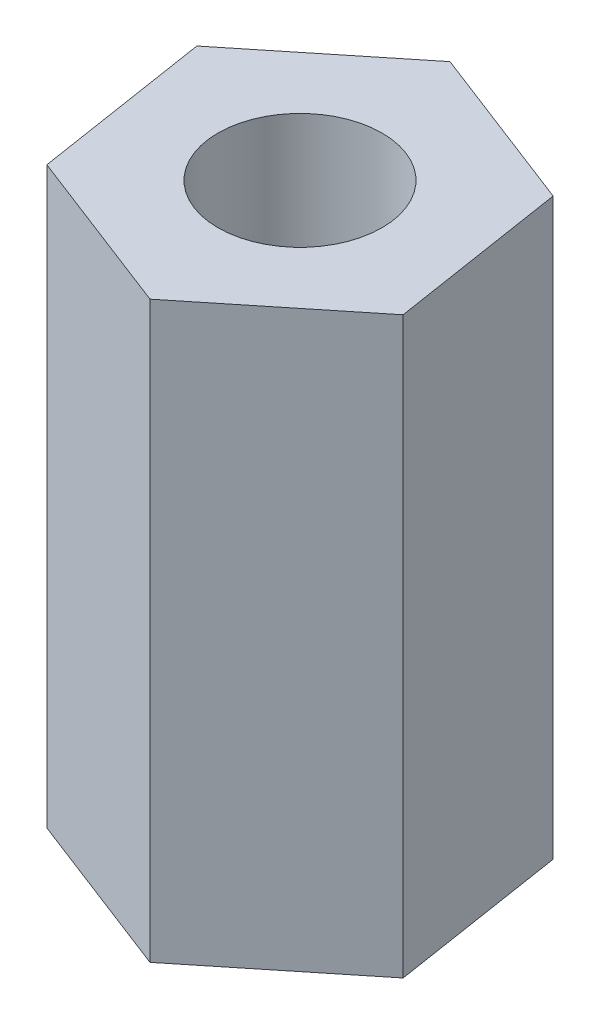
ISO-10303-21;
HEADER;
FILE_DESCRIPTION(('STEP AP214'),'2;1');
FILE_NAME('part.step','',(''),(''),'','','');
FILE_SCHEMA(('AUTOMOTIVE_DESIGN { 1 0 10303 214 1 1 1 1 }'));
ENDSEC;
DATA;
#1=APPLICATION_CONTEXT('core data for automotive mechanical design processes');
#2=APPLICATION_PROTOCOL_DEFINITION('international standard','automotive_design',2000,#1);
#3=PRODUCT_CONTEXT('',#1,'mechanical');
#4=PRODUCT('Part','Part','',(#3));
#5=PRODUCT_RELATED_PRODUCT_CATEGORY('part','',(#4));
#6=PRODUCT_DEFINITION_FORMATION('','',#4);
#7=PRODUCT_DEFINITION_CONTEXT('part definition',#1,'design');
#8=PRODUCT_DEFINITION('design','',#6,#7);
#9=PRODUCT_DEFINITION_SHAPE('','',#8);
#10=(LENGTH_UNIT() NAMED_UNIT(*) SI_UNIT(.MILLI.,.METRE.));
#11=(NAMED_UNIT(*) PLANE_ANGLE_UNIT() SI_UNIT($,.RADIAN.));
#12=(NAMED_UNIT(*) SI_UNIT($,.STERADIAN.) SOLID_ANGLE_UNIT());
#13=UNCERTAINTY_MEASURE_WITH_UNIT(LENGTH_MEASURE(1.E-05),#10,'distance_accuracy_value','');
#14=(GEOMETRIC_REPRESENTATION_CONTEXT(3) GLOBAL_UNCERTAINTY_ASSIGNED_CONTEXT((#13)) GLOBAL_UNIT_ASSIGNED_CONTEXT((#10,
#11,#12)) REPRESENTATION_CONTEXT('',''));
#15=CARTESIAN_POINT('',(0.,0.,0.));
#16=DIRECTION('',(0.,0.,1.));
#17=DIRECTION('',(1.,0.,0.));
#18=AXIS2_PLACEMENT_3D('',#15,#16,#17);
#19=CARTESIAN_POINT('',(0.,35.,0.));
#20=DIRECTION('',(0.,1.,0.));
#21=DIRECTION('',(0.,0.,1.));
#22=AXIS2_PLACEMENT_3D('',#19,#20,#21);
#23=PLANE('',#22);
#24=DIRECTION('',(-0.778296176752676,0.,0.627897333369211));
#25=VECTOR('',#24,1.);
#26=CARTESIAN_POINT('',(-1.69620434901207,35.,-10.83772227637));
#27=LINE('',#26,#25);
#28=CARTESIAN_POINT('',(-1.69620434901207,35.,-10.83772227637));
#29=VERTEX_POINT('',#28);
#30=CARTESIAN_POINT('',(-10.2338449850029,35.,-3.94990508193089));
#31=VERTEX_POINT('',#30);
#32=EDGE_CURVE('E150',#29,#31,#27,.T.);
#33=ORIENTED_EDGE('',*,*,#32,.T.);
#34=DIRECTION('',(0.154626953289905,0.,0.987972927420727));
#35=VECTOR('',#34,1.);
#36=CARTESIAN_POINT('',(-10.2338449850029,35.,-3.94990508193089));
#37=LINE('',#36,#35);
#38=CARTESIAN_POINT('',(-8.53764063599088,35.,6.88781719443908));
#39=VERTEX_POINT('',#38);
#40=EDGE_CURVE('E98',#31,#39,#37,.T.);
#41=ORIENTED_EDGE('',*,*,#40,.T.);
#42=DIRECTION('',(0.932923130042582,0.,0.360075594051516));
#43=VECTOR('',#42,1.);
#44=CARTESIAN_POINT('',(-8.53764063599088,35.,6.88781719443908));
#45=LINE('',#44,#43);
#46=CARTESIAN_POINT('',(1.69620434901207,35.,10.83772227637));
#47=VERTEX_POINT('',#46);
#48=EDGE_CURVE('E111',#39,#47,#45,.T.);
#49=ORIENTED_EDGE('',*,*,#48,.T.);
#50=DIRECTION('',(0.778296176752677,0.,-0.627897333369211));
#51=VECTOR('',#50,1.);
#52=CARTESIAN_POINT('',(1.69620434901207,35.,10.83772227637));
#53=LINE('',#52,#51);
#54=CARTESIAN_POINT('',(10.2338449850029,35.,3.94990508193089));
#55=VERTEX_POINT('',#54);
#56=EDGE_CURVE('E105',#47,#55,#53,.T.);
#57=ORIENTED_EDGE('',*,*,#56,.T.);
#58=DIRECTION('',(-0.154626953289905,0.,-0.987972927420727));
#59=VECTOR('',#58,1.);
#60=CARTESIAN_POINT('',(10.2338449850029,35.,3.94990508193089));
#61=LINE('',#60,#59);
#62=CARTESIAN_POINT('',(8.53764063599088,35.,-6.88781719443908));
#63=VERTEX_POINT('',#62);
#64=EDGE_CURVE('E109',#55,#63,#61,.T.);
#65=ORIENTED_EDGE('',*,*,#64,.T.);
#66=DIRECTION('',(-0.932923130042582,0.,-0.360075594051516));
#67=VECTOR('',#66,1.);
#68=CARTESIAN_POINT('',(8.53764063599088,35.,-6.88781719443908));
#69=LINE('',#68,#67);
#70=EDGE_CURVE('E61',#63,#29,#69,.T.);
#71=ORIENTED_EDGE('',*,*,#70,.T.);
#72=EDGE_LOOP('',(#33,#41,#49,#57,#65,#71));
#73=FACE_BOUND('',#72,.T.);
#74=CARTESIAN_POINT('',(0.,35.,0.));
#75=DIRECTION('',(0.,1.,0.));
#76=DIRECTION('',(0.,0.,1.));
#77=AXIS2_PLACEMENT_3D('',#74,#75,#76);
#78=CIRCLE('',#77,5.);
#79=CARTESIAN_POINT('',(0.,35.,5.));
#80=VERTEX_POINT('',#79);
#81=EDGE_CURVE('E138',#80,#80,#78,.T.);
#82=ORIENTED_EDGE('',*,*,#81,.F.);
#83=EDGE_LOOP('',(#82));
#84=FACE_BOUND('',#83,.T.);
#85=ADVANCED_FACE('F43',(#73,#84),#23,.T.);
#86=CARTESIAN_POINT('',(0.,0.,0.));
#87=DIRECTION('',(0.,1.,0.));
#88=DIRECTION('',(0.,0.,1.));
#89=AXIS2_PLACEMENT_3D('',#86,#87,#88);
#90=PLANE('',#89);
#91=DIRECTION('',(-0.778296176752676,0.,0.627897333369211));
#92=VECTOR('',#91,1.);
#93=CARTESIAN_POINT('',(-1.69620434901207,0.,-10.83772227637));
#94=LINE('',#93,#92);
#95=CARTESIAN_POINT('',(-1.69620434901207,0.,-10.83772227637));
#96=VERTEX_POINT('',#95);
#97=CARTESIAN_POINT('',(-10.2338449850029,0.,-3.94990508193089));
#98=VERTEX_POINT('',#97);
#99=EDGE_CURVE('E133',#96,#98,#94,.T.);
#100=ORIENTED_EDGE('',*,*,#99,.F.);
#101=DIRECTION('',(-0.932923130042582,0.,-0.360075594051516));
#102=VECTOR('',#101,1.);
#103=CARTESIAN_POINT('',(8.53764063599088,0.,-6.88781719443908));
#104=LINE('',#103,#102);
#105=CARTESIAN_POINT('',(8.53764063599088,0.,-6.88781719443908));
#106=VERTEX_POINT('',#105);
#107=EDGE_CURVE('E90',#106,#96,#104,.T.);
#108=ORIENTED_EDGE('',*,*,#107,.F.);
#109=DIRECTION('',(-0.154626953289905,0.,-0.987972927420727));
#110=VECTOR('',#109,1.);
#111=CARTESIAN_POINT('',(10.2338449850029,0.,3.94990508193089));
#112=LINE('',#111,#110);
#113=CARTESIAN_POINT('',(10.2338449850029,0.,3.94990508193089));
#114=VERTEX_POINT('',#113);
#115=EDGE_CURVE('E84',#114,#106,#112,.T.);
#116=ORIENTED_EDGE('',*,*,#115,.F.);
#117=DIRECTION('',(0.778296176752677,0.,-0.627897333369211));
#118=VECTOR('',#117,1.);
#119=CARTESIAN_POINT('',(1.69620434901207,0.,10.83772227637));
#120=LINE('',#119,#118);
#121=CARTESIAN_POINT('',(1.69620434901207,0.,10.83772227637));
#122=VERTEX_POINT('',#121);
#123=EDGE_CURVE('E120',#122,#114,#120,.T.);
#124=ORIENTED_EDGE('',*,*,#123,.F.);
#125=DIRECTION('',(0.932923130042582,0.,0.360075594051516));
#126=VECTOR('',#125,1.);
#127=CARTESIAN_POINT('',(-8.53764063599088,0.,6.88781719443908));
#128=LINE('',#127,#126);
#129=CARTESIAN_POINT('',(-8.53764063599088,0.,6.88781719443908));
#130=VERTEX_POINT('',#129);
#131=EDGE_CURVE('E141',#130,#122,#128,.T.);
#132=ORIENTED_EDGE('',*,*,#131,.F.);
#133=DIRECTION('',(0.154626953289905,0.,0.987972927420727));
#134=VECTOR('',#133,1.);
#135=CARTESIAN_POINT('',(-10.2338449850029,0.,-3.94990508193089));
#136=LINE('',#135,#134);
#137=EDGE_CURVE('E137',#98,#130,#136,.T.);
#138=ORIENTED_EDGE('',*,*,#137,.F.);
#139=EDGE_LOOP('',(#100,#108,#116,#124,#132,#138));
#140=FACE_BOUND('',#139,.T.);
#141=CARTESIAN_POINT('',(0.,0.,0.));
#142=DIRECTION('',(0.,1.,0.));
#143=DIRECTION('',(0.,0.,1.));
#144=AXIS2_PLACEMENT_3D('',#141,#142,#143);
#145=CIRCLE('',#144,5.);
#146=CARTESIAN_POINT('',(0.,0.,5.));
#147=VERTEX_POINT('',#146);
#148=EDGE_CURVE('E265',#147,#147,#145,.T.);
#149=ORIENTED_EDGE('',*,*,#148,.T.);
#150=EDGE_LOOP('',(#149));
#151=FACE_BOUND('',#150,.T.);
#152=ADVANCED_FACE('F163',(#140,#151),#90,.F.);
#153=CARTESIAN_POINT('',(-1.69620434901207,35.,-10.83772227637));
#154=DIRECTION('',(0.627897333369211,0.,0.778296176752676));
#155=DIRECTION('',(0.778296176752676,0.,-0.627897333369211));
#156=AXIS2_PLACEMENT_3D('',#153,#154,#155);
#157=PLANE('',#156);
#158=ORIENTED_EDGE('',*,*,#99,.T.);
#159=DIRECTION('',(0.,-1.,0.));
#160=VECTOR('',#159,1.);
#161=CARTESIAN_POINT('',(-10.2338449850029,35.,-3.94990508193089));
#162=LINE('',#161,#160);
#163=EDGE_CURVE('E11',#31,#98,#162,.T.);
#164=ORIENTED_EDGE('',*,*,#163,.F.);
#165=ORIENTED_EDGE('',*,*,#32,.F.);
#166=DIRECTION('',(0.,-1.,0.));
#167=VECTOR('',#166,1.);
#168=CARTESIAN_POINT('',(-1.69620434901207,35.,-10.83772227637));
#169=LINE('',#168,#167);
#170=EDGE_CURVE('E129',#29,#96,#169,.T.);
#171=ORIENTED_EDGE('',*,*,#170,.T.);
#172=EDGE_LOOP('',(#158,#164,#165,#171));
#173=FACE_BOUND('',#172,.T.);
#174=ADVANCED_FACE('F45',(#173),#157,.F.);
#175=CARTESIAN_POINT('',(-10.2338449850029,35.,-3.94990508193089));
#176=DIRECTION('',(0.987972927420727,0.,-0.154626953289905));
#177=DIRECTION('',(-0.154626953289905,0.,-0.987972927420727));
#178=AXIS2_PLACEMENT_3D('',#175,#176,#177);
#179=PLANE('',#178);
#180=ORIENTED_EDGE('',*,*,#137,.T.);
#181=DIRECTION('',(0.,-1.,0.));
#182=VECTOR('',#181,1.);
#183=CARTESIAN_POINT('',(-8.53764063599088,35.,6.88781719443908));
#184=LINE('',#183,#182);
#185=EDGE_CURVE('E53',#39,#130,#184,.T.);
#186=ORIENTED_EDGE('',*,*,#185,.F.);
#187=ORIENTED_EDGE('',*,*,#40,.F.);
#188=ORIENTED_EDGE('',*,*,#163,.T.);
#189=EDGE_LOOP('',(#180,#186,#187,#188));
#190=FACE_BOUND('',#189,.T.);
#191=ADVANCED_FACE('F188',(#190),#179,.F.);
#192=CARTESIAN_POINT('',(-8.53764063599088,35.,6.88781719443908));
#193=DIRECTION('',(0.360075594051516,0.,-0.932923130042582));
#194=DIRECTION('',(-0.932923130042582,0.,-0.360075594051516));
#195=AXIS2_PLACEMENT_3D('',#192,#193,#194);
#196=PLANE('',#195);
#197=ORIENTED_EDGE('',*,*,#131,.T.);
#198=DIRECTION('',(0.,-1.,0.));
#199=VECTOR('',#198,1.);
#200=CARTESIAN_POINT('',(1.69620434901207,35.,10.83772227637));
#201=LINE('',#200,#199);
#202=EDGE_CURVE('E122',#47,#122,#201,.T.);
#203=ORIENTED_EDGE('',*,*,#202,.F.);
#204=ORIENTED_EDGE('',*,*,#48,.F.);
#205=ORIENTED_EDGE('',*,*,#185,.T.);
#206=EDGE_LOOP('',(#197,#203,#204,#205));
#207=FACE_BOUND('',#206,.T.);
#208=ADVANCED_FACE('F160',(#207),#196,.F.);
#209=CARTESIAN_POINT('',(1.69620434901207,35.,10.83772227637));
#210=DIRECTION('',(-0.627897333369211,0.,-0.778296176752677));
#211=DIRECTION('',(-0.778296176752677,0.,0.627897333369211));
#212=AXIS2_PLACEMENT_3D('',#209,#210,#211);
#213=PLANE('',#212);
#214=ORIENTED_EDGE('',*,*,#123,.T.);
#215=DIRECTION('',(0.,-1.,0.));
#216=VECTOR('',#215,1.);
#217=CARTESIAN_POINT('',(10.2338449850029,35.,3.94990508193089));
#218=LINE('',#217,#216);
#219=EDGE_CURVE('E117',#55,#114,#218,.T.);
#220=ORIENTED_EDGE('',*,*,#219,.F.);
#221=ORIENTED_EDGE('',*,*,#56,.F.);
#222=ORIENTED_EDGE('',*,*,#202,.T.);
#223=EDGE_LOOP('',(#214,#220,#221,#222));
#224=FACE_BOUND('',#223,.T.);
#225=ADVANCED_FACE('F118',(#224),#213,.F.);
#226=CARTESIAN_POINT('',(10.2338449850029,35.,3.94990508193089));
#227=DIRECTION('',(-0.987972927420727,0.,0.154626953289905));
#228=DIRECTION('',(0.154626953289905,0.,0.987972927420727));
#229=AXIS2_PLACEMENT_3D('',#226,#227,#228);
#230=PLANE('',#229);
#231=ORIENTED_EDGE('',*,*,#115,.T.);
#232=DIRECTION('',(0.,-1.,0.));
#233=VECTOR('',#232,1.);
#234=CARTESIAN_POINT('',(8.53764063599088,35.,-6.88781719443908));
#235=LINE('',#234,#233);
#236=EDGE_CURVE('E123',#63,#106,#235,.T.);
#237=ORIENTED_EDGE('',*,*,#236,.F.);
#238=ORIENTED_EDGE('',*,*,#64,.F.);
#239=ORIENTED_EDGE('',*,*,#219,.T.);
#240=EDGE_LOOP('',(#231,#237,#238,#239));
#241=FACE_BOUND('',#240,.T.);
#242=ADVANCED_FACE('F125',(#241),#230,.F.);
#243=CARTESIAN_POINT('',(8.53764063599088,35.,-6.88781719443908));
#244=DIRECTION('',(-0.360075594051516,0.,0.932923130042582));
#245=DIRECTION('',(0.932923130042582,0.,0.360075594051516));
#246=AXIS2_PLACEMENT_3D('',#243,#244,#245);
#247=PLANE('',#246);
#248=ORIENTED_EDGE('',*,*,#107,.T.);
#249=ORIENTED_EDGE('',*,*,#170,.F.);
#250=ORIENTED_EDGE('',*,*,#70,.F.);
#251=ORIENTED_EDGE('',*,*,#236,.T.);
#252=EDGE_LOOP('',(#248,#249,#250,#251));
#253=FACE_BOUND('',#252,.T.);
#254=ADVANCED_FACE('F168',(#253),#247,.F.);
#255=CARTESIAN_POINT('',(0.,35.,0.));
#256=DIRECTION('',(0.,-1.,0.));
#257=DIRECTION('',(0.,0.,-1.));
#258=AXIS2_PLACEMENT_3D('',#255,#256,#257);
#259=CYLINDRICAL_SURFACE('',#258,5.);
#260=ORIENTED_EDGE('',*,*,#81,.T.);
#261=EDGE_LOOP('',(#260));
#262=FACE_BOUND('',#261,.T.);
#263=ORIENTED_EDGE('',*,*,#148,.F.);
#264=EDGE_LOOP('',(#263));
#265=FACE_BOUND('',#264,.T.);
#266=ADVANCED_FACE('F170',(#262,#265),#259,.F.);
#267=CLOSED_SHELL('',(#85,#152,#174,#191,#208,#225,#242,#254,#266));
#268=MANIFOLD_SOLID_BREP('B2',#267);
#269=ADVANCED_BREP_SHAPE_REPRESENTATION('',(#18,#268),#14);
#270=SHAPE_DEFINITION_REPRESENTATION(#9,#269);
ENDSEC;
END-ISO-10303-21;
